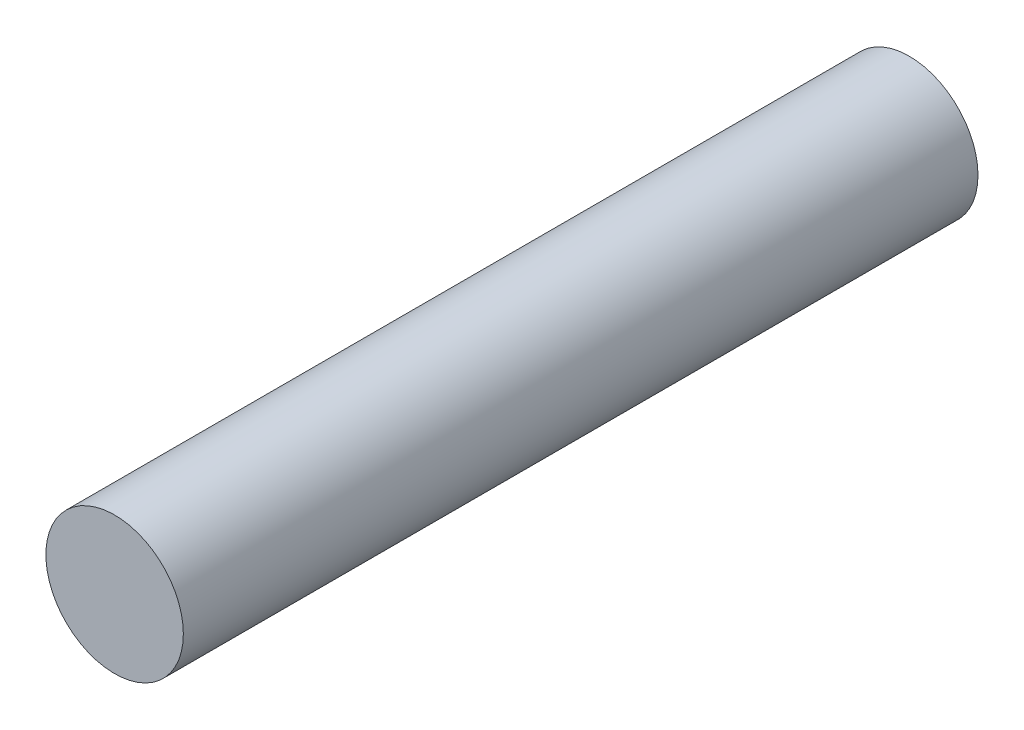
ISO-10303-21;
HEADER;
FILE_DESCRIPTION(('STEP AP214'),'2;1');
FILE_NAME('part.step','',(''),(''),'','','');
FILE_SCHEMA(('AUTOMOTIVE_DESIGN { 1 0 10303 214 1 1 1 1 }'));
ENDSEC;
DATA;
#1=APPLICATION_CONTEXT('core data for automotive mechanical design processes');
#2=APPLICATION_PROTOCOL_DEFINITION('international standard','automotive_design',2000,#1);
#3=PRODUCT_CONTEXT('',#1,'mechanical');
#4=PRODUCT('Part','Part','',(#3));
#5=PRODUCT_RELATED_PRODUCT_CATEGORY('part','',(#4));
#6=PRODUCT_DEFINITION_FORMATION('','',#4);
#7=PRODUCT_DEFINITION_CONTEXT('part definition',#1,'design');
#8=PRODUCT_DEFINITION('design','',#6,#7);
#9=PRODUCT_DEFINITION_SHAPE('','',#8);
#10=(LENGTH_UNIT() NAMED_UNIT(*) SI_UNIT(.MILLI.,.METRE.));
#11=(NAMED_UNIT(*) PLANE_ANGLE_UNIT() SI_UNIT($,.RADIAN.));
#12=(NAMED_UNIT(*) SI_UNIT($,.STERADIAN.) SOLID_ANGLE_UNIT());
#13=UNCERTAINTY_MEASURE_WITH_UNIT(LENGTH_MEASURE(1.E-05),#10,'distance_accuracy_value','');
#14=(GEOMETRIC_REPRESENTATION_CONTEXT(3) GLOBAL_UNCERTAINTY_ASSIGNED_CONTEXT((#13)) GLOBAL_UNIT_ASSIGNED_CONTEXT((#10,
#11,#12)) REPRESENTATION_CONTEXT('',''));
#15=CARTESIAN_POINT('',(0.,0.,0.));
#16=DIRECTION('',(0.,0.,1.));
#17=DIRECTION('',(1.,0.,0.));
#18=AXIS2_PLACEMENT_3D('',#15,#16,#17);
#19=CARTESIAN_POINT('',(-39.890553187095,50.7386048471501,9.));
#20=DIRECTION('',(0.,0.,-1.));
#21=DIRECTION('',(-1.,0.,0.));
#22=AXIS2_PLACEMENT_3D('',#19,#20,#21);
#23=CYLINDRICAL_SURFACE('',#22,4.06538173152769);
#24=CARTESIAN_POINT('',(-39.890553187095,50.7386048471501,9.));
#25=DIRECTION('',(0.,0.,1.));
#26=DIRECTION('',(1.,0.,0.));
#27=AXIS2_PLACEMENT_3D('',#24,#25,#26);
#28=CIRCLE('',#27,4.06538173152769);
#29=CARTESIAN_POINT('',(-35.8251714555673,50.7386048471501,9.));
#30=VERTEX_POINT('',#29);
#31=EDGE_CURVE('E10',#30,#30,#28,.T.);
#32=ORIENTED_EDGE('',*,*,#31,.F.);
#33=EDGE_LOOP('',(#32));
#34=FACE_BOUND('',#33,.T.);
#35=CARTESIAN_POINT('',(-39.890553187095,50.7386048471501,-38.));
#36=DIRECTION('',(0.,0.,1.));
#37=DIRECTION('',(1.,0.,0.));
#38=AXIS2_PLACEMENT_3D('',#35,#36,#37);
#39=CIRCLE('',#38,4.06538173152769);
#40=CARTESIAN_POINT('',(-35.8251714555673,50.7386048471501,-38.));
#41=VERTEX_POINT('',#40);
#42=EDGE_CURVE('E20',#41,#41,#39,.T.);
#43=ORIENTED_EDGE('',*,*,#42,.T.);
#44=EDGE_LOOP('',(#43));
#45=FACE_BOUND('',#44,.T.);
#46=ADVANCED_FACE('F14',(#34,#45),#23,.T.);
#47=CARTESIAN_POINT('',(-39.890553187095,50.7386048471501,9.));
#48=DIRECTION('',(0.,0.,1.));
#49=DIRECTION('',(1.,0.,0.));
#50=AXIS2_PLACEMENT_3D('',#47,#48,#49);
#51=PLANE('',#50);
#52=ORIENTED_EDGE('',*,*,#31,.T.);
#53=EDGE_LOOP('',(#52));
#54=FACE_BOUND('',#53,.T.);
#55=ADVANCED_FACE('F29',(#54),#51,.T.);
#56=CARTESIAN_POINT('',(-39.890553187095,50.7386048471501,-38.));
#57=DIRECTION('',(0.,0.,1.));
#58=DIRECTION('',(1.,0.,0.));
#59=AXIS2_PLACEMENT_3D('',#56,#57,#58);
#60=PLANE('',#59);
#61=ORIENTED_EDGE('',*,*,#42,.F.);
#62=EDGE_LOOP('',(#61));
#63=FACE_BOUND('',#62,.T.);
#64=ADVANCED_FACE('F27',(#63),#60,.F.);
#65=CLOSED_SHELL('',(#46,#55,#64));
#66=MANIFOLD_SOLID_BREP('B1',#65);
#67=ADVANCED_BREP_SHAPE_REPRESENTATION('',(#18,#66),#14);
#68=SHAPE_DEFINITION_REPRESENTATION(#9,#67);
ENDSEC;
END-ISO-10303-21;
